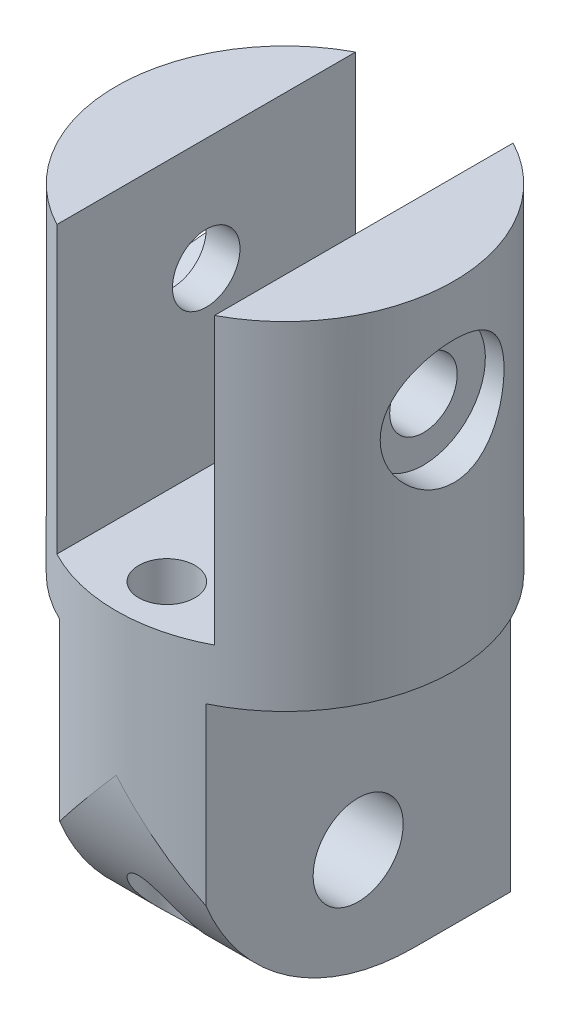
ISO-10303-21;
HEADER;
FILE_DESCRIPTION(('STEP AP214'),'2;1');
FILE_NAME('part.step','',(''),(''),'','','');
FILE_SCHEMA(('AUTOMOTIVE_DESIGN { 1 0 10303 214 1 1 1 1 }'));
ENDSEC;
DATA;
#1=APPLICATION_CONTEXT('core data for automotive mechanical design processes');
#2=APPLICATION_PROTOCOL_DEFINITION('international standard','automotive_design',2000,#1);
#3=PRODUCT_CONTEXT('',#1,'mechanical');
#4=PRODUCT('Part','Part','',(#3));
#5=PRODUCT_RELATED_PRODUCT_CATEGORY('part','',(#4));
#6=PRODUCT_DEFINITION_FORMATION('','',#4);
#7=PRODUCT_DEFINITION_CONTEXT('part definition',#1,'design');
#8=PRODUCT_DEFINITION('design','',#6,#7);
#9=PRODUCT_DEFINITION_SHAPE('','',#8);
#10=(LENGTH_UNIT() NAMED_UNIT(*) SI_UNIT(.MILLI.,.METRE.));
#11=(NAMED_UNIT(*) PLANE_ANGLE_UNIT() SI_UNIT($,.RADIAN.));
#12=(NAMED_UNIT(*) SI_UNIT($,.STERADIAN.) SOLID_ANGLE_UNIT());
#13=UNCERTAINTY_MEASURE_WITH_UNIT(LENGTH_MEASURE(1.E-05),#10,'distance_accuracy_value','');
#14=(GEOMETRIC_REPRESENTATION_CONTEXT(3) GLOBAL_UNCERTAINTY_ASSIGNED_CONTEXT((#13)) GLOBAL_UNIT_ASSIGNED_CONTEXT((#10,
#11,#12)) REPRESENTATION_CONTEXT('',''));
#15=CARTESIAN_POINT('',(0.,0.,0.));
#16=DIRECTION('',(0.,0.,1.));
#17=DIRECTION('',(1.,0.,0.));
#18=AXIS2_PLACEMENT_3D('',#15,#16,#17);
#19=CARTESIAN_POINT('',(3.25,7.,15.));
#20=DIRECTION('',(-1.,0.,0.));
#21=DIRECTION('',(0.,-1.,0.));
#22=AXIS2_PLACEMENT_3D('',#19,#20,#21);
#23=PLANE('',#22);
#24=CARTESIAN_POINT('',(3.25,-2.,7.5));
#25=DIRECTION('',(1.,0.,0.));
#26=DIRECTION('',(0.,1.,0.));
#27=AXIS2_PLACEMENT_3D('',#24,#25,#26);
#28=CIRCLE('',#27,2.);
#29=CARTESIAN_POINT('',(3.25,0.,7.5));
#30=VERTEX_POINT('',#29);
#31=EDGE_CURVE('E361',#30,#30,#28,.T.);
#32=ORIENTED_EDGE('',*,*,#31,.F.);
#33=EDGE_LOOP('',(#32));
#34=FACE_BOUND('',#33,.T.);
#35=DIRECTION('',(0.,1.,0.));
#36=VECTOR('',#35,1.);
#37=CARTESIAN_POINT('',(3.25,-7.,0.740747082702113));
#38=LINE('',#37,#36);
#39=CARTESIAN_POINT('',(3.25,-7.,0.740747082702113));
#40=VERTEX_POINT('',#39);
#41=CARTESIAN_POINT('',(3.25,7.,0.740747082702113));
#42=VERTEX_POINT('',#41);
#43=EDGE_CURVE('E240',#40,#42,#38,.T.);
#44=ORIENTED_EDGE('',*,*,#43,.T.);
#45=DIRECTION('',(0.,0.,-1.));
#46=VECTOR('',#45,1.);
#47=CARTESIAN_POINT('',(3.25,7.,15.));
#48=LINE('',#47,#46);
#49=CARTESIAN_POINT('',(3.25,7.,14.2592529172979));
#50=VERTEX_POINT('',#49);
#51=EDGE_CURVE('E379',#50,#42,#48,.T.);
#52=ORIENTED_EDGE('',*,*,#51,.F.);
#53=DIRECTION('',(0.,1.,0.));
#54=VECTOR('',#53,1.);
#55=CARTESIAN_POINT('',(3.25,-7.,14.2592529172979));
#56=LINE('',#55,#54);
#57=CARTESIAN_POINT('',(3.25,-0.777067038524808,14.2592529172979));
#58=VERTEX_POINT('',#57);
#59=EDGE_CURVE('E249',#58,#50,#56,.T.);
#60=ORIENTED_EDGE('',*,*,#59,.F.);
#61=CARTESIAN_POINT('',(3.25,3.,5.));
#62=DIRECTION('',(-1.,0.,0.));
#63=DIRECTION('',(0.,-1.,0.));
#64=AXIS2_PLACEMENT_3D('',#61,#62,#63);
#65=CIRCLE('',#64,10.);
#66=CARTESIAN_POINT('',(3.25,-7.,5.));
#67=VERTEX_POINT('',#66);
#68=EDGE_CURVE('E382',#58,#67,#65,.F.);
#69=ORIENTED_EDGE('',*,*,#68,.T.);
#70=DIRECTION('',(0.,0.,-1.));
#71=VECTOR('',#70,1.);
#72=CARTESIAN_POINT('',(3.25,-7.,15.));
#73=LINE('',#72,#71);
#74=EDGE_CURVE('E364',#67,#40,#73,.T.);
#75=ORIENTED_EDGE('',*,*,#74,.T.);
#76=EDGE_LOOP('',(#44,#52,#60,#69,#75));
#77=FACE_BOUND('',#76,.T.);
#78=ADVANCED_FACE('F68',(#34,#77),#23,.F.);
#79=CARTESIAN_POINT('',(-3.25,-7.,15.));
#80=DIRECTION('',(0.,1.,0.));
#81=DIRECTION('',(0.,0.,1.));
#82=AXIS2_PLACEMENT_3D('',#79,#80,#81);
#83=PLANE('',#82);
#84=CARTESIAN_POINT('',(0.,-7.,3.));
#85=DIRECTION('',(0.,-1.,0.));
#86=DIRECTION('',(0.,0.,-1.));
#87=AXIS2_PLACEMENT_3D('',#84,#85,#86);
#88=CIRCLE('',#87,1.25);
#89=CARTESIAN_POINT('',(0.,-7.,1.75));
#90=VERTEX_POINT('',#89);
#91=EDGE_CURVE('E649',#90,#90,#88,.T.);
#92=ORIENTED_EDGE('',*,*,#91,.F.);
#93=EDGE_LOOP('',(#92));
#94=FACE_BOUND('',#93,.T.);
#95=CARTESIAN_POINT('',(0.,-7.,7.5));
#96=DIRECTION('',(0.,1.,0.));
#97=DIRECTION('',(0.,0.,1.));
#98=AXIS2_PLACEMENT_3D('',#95,#96,#97);
#99=CIRCLE('',#98,7.5);
#100=CARTESIAN_POINT('',(-3.25,-7.,0.740747082702113));
#101=VERTEX_POINT('',#100);
#102=EDGE_CURVE('E250',#40,#101,#99,.T.);
#103=ORIENTED_EDGE('',*,*,#102,.F.);
#104=ORIENTED_EDGE('',*,*,#74,.F.);
#105=DIRECTION('',(1.,0.,0.));
#106=VECTOR('',#105,1.);
#107=CARTESIAN_POINT('',(-3.25,-7.,5.));
#108=LINE('',#107,#106);
#109=CARTESIAN_POINT('',(-3.25,-7.,5.));
#110=VERTEX_POINT('',#109);
#111=EDGE_CURVE('E384',#67,#110,#108,.F.);
#112=ORIENTED_EDGE('',*,*,#111,.T.);
#113=DIRECTION('',(0.,0.,-1.));
#114=VECTOR('',#113,1.);
#115=CARTESIAN_POINT('',(-3.25,-7.,15.));
#116=LINE('',#115,#114);
#117=EDGE_CURVE('E373',#110,#101,#116,.T.);
#118=ORIENTED_EDGE('',*,*,#117,.T.);
#119=EDGE_LOOP('',(#103,#104,#112,#118));
#120=FACE_BOUND('',#119,.T.);
#121=ADVANCED_FACE('F329',(#94,#120),#83,.F.);
#122=CARTESIAN_POINT('',(-3.25,7.,15.));
#123=DIRECTION('',(1.,0.,0.));
#124=DIRECTION('',(0.,1.,0.));
#125=AXIS2_PLACEMENT_3D('',#122,#123,#124);
#126=PLANE('',#125);
#127=CARTESIAN_POINT('',(-3.25,-2.,7.5));
#128=DIRECTION('',(1.,0.,0.));
#129=DIRECTION('',(0.,1.,0.));
#130=AXIS2_PLACEMENT_3D('',#127,#128,#129);
#131=CIRCLE('',#130,2.);
#132=CARTESIAN_POINT('',(-3.25,0.,7.5));
#133=VERTEX_POINT('',#132);
#134=EDGE_CURVE('E359',#133,#133,#131,.T.);
#135=ORIENTED_EDGE('',*,*,#134,.T.);
#136=EDGE_LOOP('',(#135));
#137=FACE_BOUND('',#136,.T.);
#138=CARTESIAN_POINT('',(-3.25,3.,5.));
#139=DIRECTION('',(1.,0.,0.));
#140=DIRECTION('',(0.,1.,0.));
#141=AXIS2_PLACEMENT_3D('',#138,#139,#140);
#142=CIRCLE('',#141,10.);
#143=CARTESIAN_POINT('',(-3.25,-0.777067038524727,14.2592529172979));
#144=VERTEX_POINT('',#143);
#145=EDGE_CURVE('E386',#110,#144,#142,.F.);
#146=ORIENTED_EDGE('',*,*,#145,.T.);
#147=DIRECTION('',(0.,1.,0.));
#148=VECTOR('',#147,1.);
#149=CARTESIAN_POINT('',(-3.25,-7.,14.2592529172979));
#150=LINE('',#149,#148);
#151=CARTESIAN_POINT('',(-3.25,7.,14.2592529172979));
#152=VERTEX_POINT('',#151);
#153=EDGE_CURVE('E238',#144,#152,#150,.T.);
#154=ORIENTED_EDGE('',*,*,#153,.T.);
#155=DIRECTION('',(0.,0.,-1.));
#156=VECTOR('',#155,1.);
#157=CARTESIAN_POINT('',(-3.25,7.,15.));
#158=LINE('',#157,#156);
#159=CARTESIAN_POINT('',(-3.25,7.,0.740747082702112));
#160=VERTEX_POINT('',#159);
#161=EDGE_CURVE('E376',#152,#160,#158,.T.);
#162=ORIENTED_EDGE('',*,*,#161,.T.);
#163=DIRECTION('',(0.,1.,0.));
#164=VECTOR('',#163,1.);
#165=CARTESIAN_POINT('',(-3.25,-7.,0.740747082702113));
#166=LINE('',#165,#164);
#167=EDGE_CURVE('E412',#101,#160,#166,.T.);
#168=ORIENTED_EDGE('',*,*,#167,.F.);
#169=ORIENTED_EDGE('',*,*,#117,.F.);
#170=EDGE_LOOP('',(#146,#154,#162,#168,#169));
#171=FACE_BOUND('',#170,.T.);
#172=ADVANCED_FACE('F334',(#137,#171),#126,.F.);
#173=CARTESIAN_POINT('',(0.,3.,5.));
#174=DIRECTION('',(-1.,0.,0.));
#175=DIRECTION('',(0.,0.,1.));
#176=AXIS2_PLACEMENT_3D('',#173,#174,#175);
#177=CYLINDRICAL_SURFACE('',#176,10.);
#178=CARTESIAN_POINT('',(0.,-4.60034588039679,11.4988262400479));
#179=CARTESIAN_POINT('',(0.0575288109608131,-4.60034633192946,11.4988256093035));
#180=CARTESIAN_POINT('',(0.11505399772144,-4.59693401826059,11.502822715136));
#181=CARTESIAN_POINT('',(0.22823665096081,-4.5834761227697,11.5185116248287));
#182=CARTESIAN_POINT('',(0.283893883210376,-4.57342971231711,11.5302043899131));
#183=CARTESIAN_POINT('',(0.391522903078539,-4.54727481070758,11.560414189299));
#184=CARTESIAN_POINT('',(0.443509328590721,-4.53119222670741,11.578902052222));
#185=CARTESIAN_POINT('',(0.542970946334787,-4.49367037095389,11.6216094500825));
#186=CARTESIAN_POINT('',(0.590444207603541,-4.47222882047104,11.6458314230352));
#187=CARTESIAN_POINT('',(0.693858382566063,-4.41754856445222,11.7068701017729));
#188=CARTESIAN_POINT('',(0.74800982895763,-4.38270365386441,11.7452795553846));
#189=CARTESIAN_POINT('',(0.847148183723735,-4.30681705487514,11.8274129335695));
#190=CARTESIAN_POINT('',(0.89211987702798,-4.26576527170702,11.8711454925512));
#191=CARTESIAN_POINT('',(0.987252420045894,-4.16367094789748,11.9777470851912));
#192=CARTESIAN_POINT('',(1.03375682534324,-4.10064843319519,12.0419724818224));
#193=CARTESIAN_POINT('',(1.11202550102491,-3.96841120618138,12.1728634669199));
#194=CARTESIAN_POINT('',(1.14376846925352,-3.89918771589937,12.2395324330415));
#195=CARTESIAN_POINT('',(1.20512691121574,-3.72575254744175,12.4015979723462));
#196=CARTESIAN_POINT('',(1.22801220853734,-3.61925054145639,12.4970726247963));
#197=CARTESIAN_POINT('',(1.25192625827192,-3.40072630611675,12.6845018482235));
#198=CARTESIAN_POINT('',(1.25290080853041,-3.28869107409675,12.7764471281507));
#199=CARTESIAN_POINT('',(1.2390160739484,-3.10025953801128,12.9243894094759));
#200=CARTESIAN_POINT('',(1.22941770428853,-3.02467078036612,12.9819973062648));
#201=CARTESIAN_POINT('',(1.20265869273446,-2.87271614168859,13.0944508219831));
#202=CARTESIAN_POINT('',(1.18549447992938,-2.79634991035228,13.1492951229198));
#203=CARTESIAN_POINT('',(1.14397630217485,-2.64352762751517,13.2558626611615));
#204=CARTESIAN_POINT('',(1.1196297934206,-2.56707175066068,13.3075890685247));
#205=CARTESIAN_POINT('',(1.0637867813495,-2.4146576671145,13.4077218470943));
#206=CARTESIAN_POINT('',(1.03229458006037,-2.33869918916016,13.4561301931831));
#207=CARTESIAN_POINT('',(0.959546911817907,-2.18327021358453,13.5523439188718));
#208=CARTESIAN_POINT('',(0.917797461428203,-2.10388405447856,13.5999146411363));
#209=CARTESIAN_POINT('',(0.824662482152894,-1.94813724713139,13.6904545809013));
#210=CARTESIAN_POINT('',(0.773285416874435,-1.87177401232619,13.7334277883316));
#211=CARTESIAN_POINT('',(0.676695759717014,-1.74841146843393,13.8009016608124));
#212=CARTESIAN_POINT('',(0.634678644034613,-1.69976793648386,13.8269441706631));
#213=CARTESIAN_POINT('',(0.543764619578198,-1.60733393640184,13.8755374312719));
#214=CARTESIAN_POINT('',(0.494882481116181,-1.56353340082824,13.8980954657454));
#215=CARTESIAN_POINT('',(0.410328609425263,-1.50057299344001,13.9300362657961));
#216=CARTESIAN_POINT('',(0.377364323238513,-1.47863442485303,13.9410472218018));
#217=CARTESIAN_POINT('',(0.308269866690451,-1.43908401630296,13.9607487164632));
#218=CARTESIAN_POINT('',(0.272144496533989,-1.42146576535685,13.9694426950006));
#219=CARTESIAN_POINT('',(0.204140015054733,-1.39500732552652,13.9824321515032));
#220=CARTESIAN_POINT('',(0.172770922493601,-1.38513258262856,13.9872509335304));
#221=CARTESIAN_POINT('',(0.10863906512088,-1.3702186469195,13.9945127413908));
#222=CARTESIAN_POINT('',(0.0758780804831299,-1.36517346082817,13.9969587118357));
#223=CARTESIAN_POINT('',(0.00971565662024547,-1.36049332526411,13.999228082882));
#224=CARTESIAN_POINT('',(-0.0236880276005255,-1.36088324321488,13.9990394291871));
#225=CARTESIAN_POINT('',(-0.0898697850396133,-1.36708221585887,13.9960326446625));
#226=CARTESIAN_POINT('',(-0.12264736944618,-1.37289534121178,13.9932125386644));
#227=CARTESIAN_POINT('',(-0.192498993484608,-1.39076317365085,13.9845039818664));
#228=CARTESIAN_POINT('',(-0.229268404492208,-1.40376175841571,13.9781502759771));
#229=CARTESIAN_POINT('',(-0.299995279155415,-1.43484740134685,13.9628359879126));
#230=CARTESIAN_POINT('',(-0.333946810007977,-1.45294485968761,13.9538700763329));
#231=CARTESIAN_POINT('',(-0.418925600500643,-1.50503533887645,13.9278178923304));
#232=CARTESIAN_POINT('',(-0.467632638347218,-1.54196424707584,13.909126433341));
#233=CARTESIAN_POINT('',(-0.558564300251688,-1.62136560507975,13.8682014347293));
#234=CARTESIAN_POINT('',(-0.600770050090257,-1.66385355695524,13.8459579501095));
#235=CARTESIAN_POINT('',(-0.678801636651221,-1.75107385940053,13.799413769684));
#236=CARTESIAN_POINT('',(-0.714760353406768,-1.79572378952148,13.7751782289425));
#237=CARTESIAN_POINT('',(-0.782368998157438,-1.88709197799037,13.724624021988));
#238=CARTESIAN_POINT('',(-0.814015009233281,-1.93381206615915,13.6983034959845));
#239=CARTESIAN_POINT('',(-0.873578262146656,-2.02867607236967,13.6438079702081));
#240=CARTESIAN_POINT('',(-0.901487844310031,-2.07682267540891,13.6156293325072));
#241=CARTESIAN_POINT('',(-0.953869165706419,-2.17399414365024,13.5576276254842));
#242=CARTESIAN_POINT('',(-0.978339944562463,-2.22301924990456,13.5278041000089));
#243=CARTESIAN_POINT('',(-1.03648457622005,-2.34837571239289,13.4500224067966));
#244=CARTESIAN_POINT('',(-1.06794492165718,-2.42508593896396,13.4010069487532));
#245=CARTESIAN_POINT('',(-1.12359720816828,-2.57896430130894,13.2996181391025));
#246=CARTESIAN_POINT('',(-1.14778503835172,-2.65613267101885,13.2472429085551));
#247=CARTESIAN_POINT('',(-1.18880186967856,-2.81020378415608,13.1394324196061));
#248=CARTESIAN_POINT('',(-1.2056368062501,-2.8871066919307,13.0839996701717));
#249=CARTESIAN_POINT('',(-1.23159320381571,-3.04008538662955,12.970348311449));
#250=CARTESIAN_POINT('',(-1.2407185329799,-3.11616156941276,12.912131114723));
#251=CARTESIAN_POINT('',(-1.25286792344638,-3.30085753472534,12.766499936122));
#252=CARTESIAN_POINT('',(-1.2513126972625,-3.40875200184953,12.6777134732531));
#253=CARTESIAN_POINT('',(-1.22772366104796,-3.61938148403095,12.4968619169247));
#254=CARTESIAN_POINT('',(-1.20573097558767,-3.72212642360836,12.4048037644697));
#255=CARTESIAN_POINT('',(-1.14743386723128,-3.8900628974733,12.2481774324844));
#256=CARTESIAN_POINT('',(-1.11731814138053,-3.95734634387134,12.1835632594184));
#257=CARTESIAN_POINT('',(-1.04332667285176,-4.0862124112587,12.0564668539613));
#258=CARTESIAN_POINT('',(-0.999468461074937,-4.14780216661484,11.9939820172111));
#259=CARTESIAN_POINT('',(-0.908823343821531,-4.24931724766382,11.8885005866831));
#260=CARTESIAN_POINT('',(-0.865205843162854,-4.2909138401453,11.8444000545688));
#261=CARTESIAN_POINT('',(-0.76883757221327,-4.36814251288804,11.7611894906291));
#262=CARTESIAN_POINT('',(-0.716098431613276,-4.40378207569116,11.7220732130628));
#263=CARTESIAN_POINT('',(-0.612245124736067,-4.46172352984542,11.657643266576));
#264=CARTESIAN_POINT('',(-0.562586109481275,-4.48527243298603,11.6311133106998));
#265=CARTESIAN_POINT('',(-0.458065299417217,-4.52641813587298,11.584375566612));
#266=CARTESIAN_POINT('',(-0.403206475147318,-4.54401830807232,11.5641641967587));
#267=CARTESIAN_POINT('',(-0.291201637526191,-4.57200141151039,11.5318637455773));
#268=CARTESIAN_POINT('',(-0.234168560095787,-4.58257937423715,11.5195555175503));
#269=CARTESIAN_POINT('',(-0.118088610350123,-4.59675024599106,11.5030383998551));
#270=CARTESIAN_POINT('',(-0.0590423964677331,-4.60034541698428,11.4988268873873));
#271=CARTESIAN_POINT('',(0.,-4.60034588039679,11.4988262400479));
#272=B_SPLINE_CURVE_WITH_KNOTS('',3,(#178,#179,#180,#181,#182,#183,#184,#185,#186,#187,#188,
#189,#190,#191,#192,#193,#194,#195,#196,#197,#198,#199,#200,#201,#202,#203,#204,#205,#206,#207,
#208,#209,#210,#211,#212,#213,#214,#215,#216,#217,#218,#219,#220,#221,#222,#223,#224,#225,#226,
#227,#228,#229,#230,#231,#232,#233,#234,#235,#236,#237,#238,#239,#240,#241,#242,#243,#244,#245,
#246,#247,#248,#249,#250,#251,#252,#253,#254,#255,#256,#257,#258,#259,#260,#261,#262,#263,#264,
#265,#266,#267,#268,#269,#270,#271),.UNSPECIFIED.,.T.,.F.,(4,2,2,2,2,2,2,2,2,2,2,2,2,2,2,2,2,2,
2,2,2,2,2,2,2,2,2,2,2,2,2,2,2,2,2,2,2,2,2,2,2,2,2,2,2,2,4),(0.,0.172348273756097,
0.344718078712481,0.516356381687259,0.688067792913604,0.911779782670741,1.13585960792365,
1.43805653794473,1.74068822377861,2.17289589147549,2.60617262432262,2.89241887086686,
3.17880036422053,3.46488559482381,3.75079904413221,4.05491767460736,4.35877019896172,
4.56645367834022,4.77369697735467,4.89669523302743,5.0195098500147,5.11882624455042,
5.21801923115933,5.31766620732977,5.41738803875374,5.53527045520422,5.65339507916606,
5.84407282185146,6.03529410095019,6.22174555510802,6.40836523689131,6.59536181455266,
6.78241051261683,7.07097917352888,7.35971064655029,7.64820861604563,7.93656175026965,
8.35438832069885,8.77137595038052,9.06454630970578,9.35734419210841,9.58060303576063,
9.80357930464446,9.98592361306855,10.1681643728299,10.3451044636672,10.5219872279666),.UNSPECIFIED.);
#273=CARTESIAN_POINT('',(0.,-4.60034588039679,11.4988262400479));
#274=VERTEX_POINT('',#273);
#275=EDGE_CURVE('E205',#274,#274,#272,.T.);
#276=ORIENTED_EDGE('',*,*,#275,.F.);
#277=EDGE_LOOP('',(#276));
#278=FACE_BOUND('',#277,.T.);
#279=CARTESIAN_POINT('',(-3.25,-0.777067038524808,14.2592529172979));
#280=CARTESIAN_POINT('',(-3.11964803441231,-0.623422022657622,14.3219224333858));
#281=CARTESIAN_POINT('',(-2.98826751006328,-0.469006401054278,14.3804577255213));
#282=CARTESIAN_POINT('',(-2.7237404145902,-0.158847919875885,14.4894004376096));
#283=CARTESIAN_POINT('',(-2.59059398915032,-0.00310517016124126,14.539808523586));
#284=CARTESIAN_POINT('',(-2.1888915842863,0.46585242207751,14.6790735815163));
#285=CARTESIAN_POINT('',(-1.91809052694975,0.78077536711749,14.7559627524007));
#286=CARTESIAN_POINT('',(-1.37572389886744,1.4099863558356,14.8779292423823));
#287=CARTESIAN_POINT('',(-1.10419730090432,1.72424533420997,14.9233371711216));
#288=CARTESIAN_POINT('',(-0.5594483269617,2.35399928323636,14.984120133363));
#289=CARTESIAN_POINT('',(-0.286226977240884,2.66949346995055,14.9995118431247));
#290=CARTESIAN_POINT('',(-0.00872869143398145,2.9899209752028,14.9999961890182));
#291=CARTESIAN_POINT('',(-0.00436433249316354,2.9949605028181,14.9999999984407));
#292=CARTESIAN_POINT('',(0.,3.,15.));
#293=B_SPLINE_CURVE_WITH_KNOTS('',3,(#279,#280,#281,#282,#283,#284,#285,#286,#287,#288,#289,
#290,#291,#292),.UNSPECIFIED.,.F.,.F.,(4,2,2,2,2,2,4),(0.,0.632933239584302,1.26581458397719,
2.53166454368447,3.78401078214235,5.03566104994836,5.05566105321367),.UNSPECIFIED.);
#294=CARTESIAN_POINT('',(0.,3.,15.));
#295=VERTEX_POINT('',#294);
#296=EDGE_CURVE('E242',#144,#295,#293,.T.);
#297=ORIENTED_EDGE('',*,*,#296,.F.);
#298=ORIENTED_EDGE('',*,*,#145,.F.);
#299=ORIENTED_EDGE('',*,*,#111,.F.);
#300=ORIENTED_EDGE('',*,*,#68,.F.);
#301=CARTESIAN_POINT('',(3.25,-0.777067038524808,14.2592529172979));
#302=CARTESIAN_POINT('',(3.11964803441231,-0.623422022657624,14.3219224333858));
#303=CARTESIAN_POINT('',(2.98826751006328,-0.46900640105428,14.3804577255213));
#304=CARTESIAN_POINT('',(2.7237404145902,-0.158847919875886,14.4894004376096));
#305=CARTESIAN_POINT('',(2.59059398915033,-0.00310517016124023,14.539808523586));
#306=CARTESIAN_POINT('',(2.1888915842863,0.465852422077514,14.6790735815163));
#307=CARTESIAN_POINT('',(1.91809052694976,0.780775367117497,14.7559627524007));
#308=CARTESIAN_POINT('',(1.37572389886743,1.40998635583559,14.8779292423823));
#309=CARTESIAN_POINT('',(1.10419730090428,1.72424533420994,14.9233371711216));
#310=CARTESIAN_POINT('',(0.55944832696173,2.35399928323638,14.984120133363));
#311=CARTESIAN_POINT('',(0.286226977241005,2.66949346995065,14.9995118431247));
#312=CARTESIAN_POINT('',(0.00872869143398562,2.9899209752028,14.9999961890182));
#313=CARTESIAN_POINT('',(0.00436433249316565,2.99496050281811,14.9999999984407));
#314=CARTESIAN_POINT('',(0.,3.,15.));
#315=B_SPLINE_CURVE_WITH_KNOTS('',3,(#301,#302,#303,#304,#305,#306,#307,#308,#309,#310,#311,
#312,#313,#314),.UNSPECIFIED.,.F.,.F.,(4,2,2,2,2,2,4),(0.,0.632933239584303,1.26581458397719,
2.53166454368448,3.78401078214235,5.03566104994836,5.05566105321368),.UNSPECIFIED.);
#316=EDGE_CURVE('E262',#58,#295,#315,.T.);
#317=ORIENTED_EDGE('',*,*,#316,.T.);
#318=EDGE_LOOP('',(#297,#298,#299,#300,#317));
#319=FACE_BOUND('',#318,.T.);
#320=ADVANCED_FACE('F70',(#278,#319),#177,.T.);
#321=CARTESIAN_POINT('',(0.,22.,7.5));
#322=DIRECTION('',(0.,1.,0.));
#323=DIRECTION('',(0.,0.,1.));
#324=AXIS2_PLACEMENT_3D('',#321,#322,#323);
#325=PLANE('',#324);
#326=DIRECTION('',(0.,0.,1.));
#327=VECTOR('',#326,1.);
#328=CARTESIAN_POINT('',(-3.5,22.,7.5));
#329=LINE('',#328,#327);
#330=CARTESIAN_POINT('',(-3.5,22.,0.8667504192892));
#331=VERTEX_POINT('',#330);
#332=CARTESIAN_POINT('',(-3.5,22.,14.1332495807108));
#333=VERTEX_POINT('',#332);
#334=EDGE_CURVE('E390',#331,#333,#329,.T.);
#335=ORIENTED_EDGE('',*,*,#334,.F.);
#336=CARTESIAN_POINT('',(0.,22.,7.5));
#337=DIRECTION('',(0.,1.,0.));
#338=DIRECTION('',(0.,0.,1.));
#339=AXIS2_PLACEMENT_3D('',#336,#337,#338);
#340=CIRCLE('',#339,7.5);
#341=EDGE_CURVE('E367',#331,#333,#340,.T.);
#342=ORIENTED_EDGE('',*,*,#341,.T.);
#343=EDGE_LOOP('',(#335,#342));
#344=FACE_BOUND('',#343,.T.);
#345=ADVANCED_FACE('F345',(#344),#325,.T.);
#346=CARTESIAN_POINT('',(-3.25,-2.,7.5));
#347=DIRECTION('',(1.,0.,0.));
#348=DIRECTION('',(0.,1.,0.));
#349=AXIS2_PLACEMENT_3D('',#346,#347,#348);
#350=CYLINDRICAL_SURFACE('',#349,2.);
#351=ORIENTED_EDGE('',*,*,#134,.F.);
#352=EDGE_LOOP('',(#351));
#353=FACE_BOUND('',#352,.T.);
#354=ORIENTED_EDGE('',*,*,#31,.T.);
#355=EDGE_LOOP('',(#354));
#356=FACE_BOUND('',#355,.T.);
#357=ADVANCED_FACE('F342',(#353,#356),#350,.F.);
#358=CARTESIAN_POINT('',(0.,7.,7.5));
#359=DIRECTION('',(0.,1.,0.));
#360=DIRECTION('',(0.,0.,1.));
#361=AXIS2_PLACEMENT_3D('',#358,#359,#360);
#362=PLANE('',#361);
#363=CARTESIAN_POINT('',(0.,7.,7.5));
#364=DIRECTION('',(0.,1.,0.));
#365=DIRECTION('',(0.,0.,1.));
#366=AXIS2_PLACEMENT_3D('',#363,#364,#365);
#367=CIRCLE('',#366,7.5);
#368=EDGE_CURVE('E422',#50,#42,#367,.T.);
#369=ORIENTED_EDGE('',*,*,#368,.F.);
#370=ORIENTED_EDGE('',*,*,#51,.T.);
#371=EDGE_LOOP('',(#369,#370));
#372=FACE_BOUND('',#371,.T.);
#373=ADVANCED_FACE('F344',(#372),#362,.F.);
#374=CARTESIAN_POINT('',(0.,22.,7.5));
#375=DIRECTION('',(0.,-1.,0.));
#376=DIRECTION('',(0.,0.,-1.));
#377=AXIS2_PLACEMENT_3D('',#374,#375,#376);
#378=CYLINDRICAL_SURFACE('',#377,7.5);
#379=DIRECTION('',(0.,-1.,0.));
#380=VECTOR('',#379,1.);
#381=CARTESIAN_POINT('',(-6.75925291729789,22.,4.25));
#382=LINE('',#381,#380);
#383=CARTESIAN_POINT('',(-6.75925291729789,15.1236116251337,4.25));
#384=VERTEX_POINT('',#383);
#385=CARTESIAN_POINT('',(-6.75925291729789,18.8763883748663,4.25));
#386=VERTEX_POINT('',#385);
#387=EDGE_CURVE('E78',#384,#386,#382,.F.);
#388=ORIENTED_EDGE('',*,*,#387,.T.);
#389=CARTESIAN_POINT('',(0.,20.7527767497326,7.5));
#390=DIRECTION('',(0.,0.866025403784439,-0.5));
#391=DIRECTION('',(0.,-0.5,-0.866025403784439));
#392=AXIS2_PLACEMENT_3D('',#389,#390,#391);
#393=ELLIPSE('',#392,8.66025403784438,7.5);
#394=CARTESIAN_POINT('',(-7.50000000000001,20.7527767497326,7.5));
#395=VERTEX_POINT('',#394);
#396=EDGE_CURVE('E12',#386,#395,#393,.T.);
#397=ORIENTED_EDGE('',*,*,#396,.T.);
#398=CARTESIAN_POINT('',(0.,20.7527767497326,7.5));
#399=DIRECTION('',(0.,0.866025403784439,0.5));
#400=DIRECTION('',(0.,-0.5,0.866025403784439));
#401=AXIS2_PLACEMENT_3D('',#398,#399,#400);
#402=ELLIPSE('',#401,8.66025403784439,7.5);
#403=CARTESIAN_POINT('',(-6.75925291729789,18.8763883748663,10.75));
#404=VERTEX_POINT('',#403);
#405=EDGE_CURVE('E185',#395,#404,#402,.T.);
#406=ORIENTED_EDGE('',*,*,#405,.T.);
#407=DIRECTION('',(0.,-1.,0.));
#408=VECTOR('',#407,1.);
#409=CARTESIAN_POINT('',(-6.75925291729789,22.,10.75));
#410=LINE('',#409,#408);
#411=CARTESIAN_POINT('',(-6.75925291729789,15.1236116251337,10.75));
#412=VERTEX_POINT('',#411);
#413=EDGE_CURVE('E658',#404,#412,#410,.T.);
#414=ORIENTED_EDGE('',*,*,#413,.T.);
#415=CARTESIAN_POINT('',(0.,13.2472232502674,7.5));
#416=DIRECTION('',(0.,-0.866025403784439,0.5));
#417=DIRECTION('',(0.,-0.5,-0.866025403784439));
#418=AXIS2_PLACEMENT_3D('',#415,#416,#417);
#419=ELLIPSE('',#418,8.66025403784439,7.5);
#420=CARTESIAN_POINT('',(-7.5,13.2472232502674,7.5));
#421=VERTEX_POINT('',#420);
#422=EDGE_CURVE('E644',#412,#421,#419,.T.);
#423=ORIENTED_EDGE('',*,*,#422,.T.);
#424=CARTESIAN_POINT('',(0.,13.2472232502674,7.5));
#425=DIRECTION('',(0.,-0.866025403784439,-0.5));
#426=DIRECTION('',(0.,-0.5,0.866025403784439));
#427=AXIS2_PLACEMENT_3D('',#424,#425,#426);
#428=ELLIPSE('',#427,8.66025403784439,7.5);
#429=EDGE_CURVE('E641',#421,#384,#428,.T.);
#430=ORIENTED_EDGE('',*,*,#429,.T.);
#431=EDGE_LOOP('',(#388,#397,#406,#414,#423,#430));
#432=FACE_BOUND('',#431,.T.);
#433=CARTESIAN_POINT('',(7.5,14.25,7.5));
#434=CARTESIAN_POINT('',(7.50000312186943,14.2499957601559,7.64916340091462));
#435=CARTESIAN_POINT('',(7.49551083407196,14.2621745142851,7.79829715261848));
#436=CARTESIAN_POINT('',(7.47803771691331,14.3103807639427,8.09212061063863));
#437=CARTESIAN_POINT('',(7.46505769251259,14.3464059979212,8.23681073701747));
#438=CARTESIAN_POINT('',(7.43200599882739,14.4408685459559,8.51746784637522));
#439=CARTESIAN_POINT('',(7.41194764249896,14.4992638038986,8.65345064275874));
#440=CARTESIAN_POINT('',(7.36674725461798,14.6365998026205,8.91368339201444));
#441=CARTESIAN_POINT('',(7.34160392586796,14.7155457874537,9.03793033913379));
#442=CARTESIAN_POINT('',(7.28769120419502,14.8951165871431,9.2762429222357));
#443=CARTESIAN_POINT('',(7.25882233991119,14.9964330069993,9.38976472910907));
#444=CARTESIAN_POINT('',(7.20121334184221,15.2164002540435,9.59863947514447));
#445=CARTESIAN_POINT('',(7.17247324728629,15.335056036644,9.69398720232952));
#446=CARTESIAN_POINT('',(7.11723192199314,15.5915596285549,9.86719005872891));
#447=CARTESIAN_POINT('',(7.09084889561059,15.7299454567554,9.94428985961203));
#448=CARTESIAN_POINT('',(7.04484932142569,16.0188406266334,10.0738807153727));
#449=CARTESIAN_POINT('',(7.02523020673632,16.1693453424172,10.126381108384));
#450=CARTESIAN_POINT('',(6.99603990329749,16.4719588814006,10.2031578776842));
#451=CARTESIAN_POINT('',(6.98610194555094,16.6237687440343,10.2284685676662));
#452=CARTESIAN_POINT('',(6.97632326042149,16.929781189296,10.2533816996786));
#453=CARTESIAN_POINT('',(6.97647859485257,17.0839828152304,10.2529941686023));
#454=CARTESIAN_POINT('',(6.98655161563675,17.3810789225906,10.2273152463416));
#455=CARTESIAN_POINT('',(6.99591416236741,17.5241180714193,10.2034399938661));
#456=CARTESIAN_POINT('',(7.02242705549906,17.8039973045031,10.1337980138));
#457=CARTESIAN_POINT('',(7.03957852258203,17.9408364935813,10.088028135926));
#458=CARTESIAN_POINT('',(7.08008337610026,18.2073857915592,9.97508832183277));
#459=CARTESIAN_POINT('',(7.10354498086313,18.3369185940038,9.90754043957437));
#460=CARTESIAN_POINT('',(7.15398860670264,18.5832293506763,9.75322516181072));
#461=CARTESIAN_POINT('',(7.18097180350953,18.7000030210703,9.66645134069005));
#462=CARTESIAN_POINT('',(7.23752687525343,18.9253454837079,9.46960155284458));
#463=CARTESIAN_POINT('',(7.26715387777086,19.032910199767,9.35838932735392));
#464=CARTESIAN_POINT('',(7.32416772152515,19.2281537541427,9.11915779399269));
#465=CARTESIAN_POINT('',(7.3515542477326,19.3158297990106,8.99113612914646));
#466=CARTESIAN_POINT('',(7.40150404263882,19.469849921192,8.71944943250202));
#467=CARTESIAN_POINT('',(7.42399328235867,19.5358733353786,8.57558804380358));
#468=CARTESIAN_POINT('',(7.46106828194135,19.6424524315738,8.27777168193606));
#469=CARTESIAN_POINT('',(7.47565739110895,19.6830189073552,8.12382101725383));
#470=CARTESIAN_POINT('',(7.49470661210037,19.7356341007007,7.81865715690413));
#471=CARTESIAN_POINT('',(7.49964681722227,19.7490358318725,7.66770697278252));
#472=CARTESIAN_POINT('',(7.50031608885126,19.7508630018728,7.36565203255629));
#473=CARTESIAN_POINT('',(7.49604709187873,19.7392936916369,7.21454731562548));
#474=CARTESIAN_POINT('',(7.47909471176213,19.6925452079771,6.92222898460096));
#475=CARTESIAN_POINT('',(7.46672323625137,19.6582406720003,6.7808555379685));
#476=CARTESIAN_POINT('',(7.43512235809386,19.5681349472647,6.50596090832168));
#477=CARTESIAN_POINT('',(7.41589206317618,19.5123309615443,6.37244074958353));
#478=CARTESIAN_POINT('',(7.3717934654489,19.3790539116285,6.11272893005816));
#479=CARTESIAN_POINT('',(7.34677844528394,19.301001869951,5.98686004951381));
#480=CARTESIAN_POINT('',(7.29389308718916,19.1261036082178,5.74959324541106));
#481=CARTESIAN_POINT('',(7.26602173076095,19.0292506731475,5.63820051602461));
#482=CARTESIAN_POINT('',(7.20858443222809,18.813177374235,5.42659777286201));
#483=CARTESIAN_POINT('',(7.17901017230758,18.6930149402375,5.32734951094925));
#484=CARTESIAN_POINT('',(7.12301420495134,18.4371450050785,5.15025082554627));
#485=CARTESIAN_POINT('',(7.09659271654603,18.3014364251721,5.0724018882281));
#486=CARTESIAN_POINT('',(7.05004267507774,18.0174626284658,4.94034362890839));
#487=CARTESIAN_POINT('',(7.02993081583834,17.8691653988561,4.88619687043256));
#488=CARTESIAN_POINT('',(6.99881623412452,17.564621151899,4.80397675168701));
#489=CARTESIAN_POINT('',(6.98780821140261,17.4083788165147,4.77588821917411));
#490=CARTESIAN_POINT('',(6.97683139543633,17.1027486399612,4.74790483037546));
#491=CARTESIAN_POINT('',(6.97622414135252,16.9535317080346,4.74637927832575));
#492=CARTESIAN_POINT('',(6.98449276936025,16.6570884497829,4.76742136880885));
#493=CARTESIAN_POINT('',(6.99336783146823,16.5098619524497,4.789986928062));
#494=CARTESIAN_POINT('',(7.01908063198066,16.225730914034,4.85732302895733));
#495=CARTESIAN_POINT('',(7.03568945153917,16.0886530299248,4.90145689764079));
#496=CARTESIAN_POINT('',(7.0748745278557,15.8237608470382,5.01012643456598));
#497=CARTESIAN_POINT('',(7.09745226019147,15.695948848854,5.07466714836784));
#498=CARTESIAN_POINT('',(7.14745651289183,15.446173516875,5.2261214625784));
#499=CARTESIAN_POINT('',(7.17507087475862,15.3248355716804,5.31400373788159));
#500=CARTESIAN_POINT('',(7.23136315938062,15.0981067555171,5.50811900047636));
#501=CARTESIAN_POINT('',(7.26004141030265,14.9927208569003,5.61435768756782));
#502=CARTESIAN_POINT('',(7.31698041886032,14.7954400202964,5.84862840053256));
#503=CARTESIAN_POINT('',(7.34514593066589,14.7045025963147,5.97749345971985));
#504=CARTESIAN_POINT('',(7.39633669940812,14.5456226545033,6.24965784854994));
#505=CARTESIAN_POINT('',(7.41936193536523,14.4776802305249,6.39295723710164));
#506=CARTESIAN_POINT('',(7.45811714803401,14.3658300233738,6.69376598407588));
#507=CARTESIAN_POINT('',(7.4736521370045,14.3225597743705,6.85153953395494));
#508=CARTESIAN_POINT('',(7.49458959004745,14.2646534781244,7.17288901781912));
#509=CARTESIAN_POINT('',(7.4999965772887,14.2500046484207,7.336462328356));
#510=CARTESIAN_POINT('',(7.5,14.25,7.5));
#511=B_SPLINE_CURVE_WITH_KNOTS('',3,(#433,#434,#435,#436,#437,#438,#439,#440,#441,#442,#443,
#444,#445,#446,#447,#448,#449,#450,#451,#452,#453,#454,#455,#456,#457,#458,#459,#460,#461,#462,
#463,#464,#465,#466,#467,#468,#469,#470,#471,#472,#473,#474,#475,#476,#477,#478,#479,#480,#481,
#482,#483,#484,#485,#486,#487,#488,#489,#490,#491,#492,#493,#494,#495,#496,#497,#498,#499,#500,
#501,#502,#503,#504,#505,#506,#507,#508,#509,#510),.UNSPECIFIED.,.T.,.F.,(4,2,2,2,2,2,2,2,2,2,2,
2,2,2,2,2,2,2,2,2,2,2,2,2,2,2,2,2,2,2,2,2,2,2,2,2,2,2,4),(0.,0.446887269349348,0.89373216292337,
1.33974106914938,1.7858638979375,2.24842473965862,2.71111803601497,3.1905067289315,
3.66971329430219,4.12996375453753,4.5900346359978,5.0239670519462,5.45796192255757,
5.89993527296308,6.34205656133036,6.81248619551747,7.28298186270095,7.76015995462979,
8.23713558552159,8.68970480563612,9.14217886831116,9.57818454876607,10.0142469703521,
10.462896209775,10.9117059866708,11.385386450699,11.8590998032843,12.3340561236824,
12.80873572978,13.254164536792,13.6995548284528,14.13252653843,14.5656053837986,15.020648736522,
15.4758336382825,15.9541458857871,16.4324600854427,16.9226310274791,17.4125830067758),.UNSPECIFIED.);
#512=CARTESIAN_POINT('',(7.5,14.25,7.5));
#513=VERTEX_POINT('',#512);
#514=EDGE_CURVE('E274',#513,#513,#511,.T.);
#515=ORIENTED_EDGE('',*,*,#514,.T.);
#516=EDGE_LOOP('',(#515));
#517=FACE_BOUND('',#516,.T.);
#518=DIRECTION('',(0.,-1.,0.));
#519=VECTOR('',#518,1.);
#520=CARTESIAN_POINT('',(3.5,22.,14.1332495807108));
#521=LINE('',#520,#519);
#522=CARTESIAN_POINT('',(3.5,22.,14.1332495807108));
#523=VERTEX_POINT('',#522);
#524=CARTESIAN_POINT('',(3.5,9.32,14.1332495807108));
#525=VERTEX_POINT('',#524);
#526=EDGE_CURVE('E94',#523,#525,#521,.T.);
#527=ORIENTED_EDGE('',*,*,#526,.T.);
#528=CARTESIAN_POINT('',(0.,9.32,7.5));
#529=DIRECTION('',(0.,-1.,0.));
#530=DIRECTION('',(0.,0.,-1.));
#531=AXIS2_PLACEMENT_3D('',#528,#529,#530);
#532=CIRCLE('',#531,7.5);
#533=CARTESIAN_POINT('',(-3.5,9.32,14.1332495807108));
#534=VERTEX_POINT('',#533);
#535=EDGE_CURVE('E269',#525,#534,#532,.T.);
#536=ORIENTED_EDGE('',*,*,#535,.T.);
#537=DIRECTION('',(0.,-1.,0.));
#538=VECTOR('',#537,1.);
#539=CARTESIAN_POINT('',(-3.5,22.,14.1332495807108));
#540=LINE('',#539,#538);
#541=EDGE_CURVE('E401',#534,#333,#540,.F.);
#542=ORIENTED_EDGE('',*,*,#541,.T.);
#543=ORIENTED_EDGE('',*,*,#341,.F.);
#544=DIRECTION('',(0.,-1.,0.));
#545=VECTOR('',#544,1.);
#546=CARTESIAN_POINT('',(-3.5,22.,0.866750419289201));
#547=LINE('',#546,#545);
#548=CARTESIAN_POINT('',(-3.5,9.32,0.866750419289202));
#549=VERTEX_POINT('',#548);
#550=EDGE_CURVE('E420',#331,#549,#547,.T.);
#551=ORIENTED_EDGE('',*,*,#550,.T.);
#552=CARTESIAN_POINT('',(3.5,9.32,0.8667504192892));
#553=VERTEX_POINT('',#552);
#554=EDGE_CURVE('E270',#549,#553,#532,.T.);
#555=ORIENTED_EDGE('',*,*,#554,.T.);
#556=DIRECTION('',(0.,-1.,0.));
#557=VECTOR('',#556,1.);
#558=CARTESIAN_POINT('',(3.5,22.,0.866750419289201));
#559=LINE('',#558,#557);
#560=CARTESIAN_POINT('',(3.5,22.,0.8667504192892));
#561=VERTEX_POINT('',#560);
#562=EDGE_CURVE('E411',#553,#561,#559,.F.);
#563=ORIENTED_EDGE('',*,*,#562,.T.);
#564=EDGE_CURVE('E362',#523,#561,#340,.T.);
#565=ORIENTED_EDGE('',*,*,#564,.F.);
#566=EDGE_LOOP('',(#527,#536,#542,#543,#551,#555,#563,#565));
#567=FACE_BOUND('',#566,.T.);
#568=EDGE_CURVE('E421',#160,#152,#367,.T.);
#569=ORIENTED_EDGE('',*,*,#568,.T.);
#570=ORIENTED_EDGE('',*,*,#153,.F.);
#571=ORIENTED_EDGE('',*,*,#296,.T.);
#572=ORIENTED_EDGE('',*,*,#316,.F.);
#573=ORIENTED_EDGE('',*,*,#59,.T.);
#574=ORIENTED_EDGE('',*,*,#368,.T.);
#575=ORIENTED_EDGE('',*,*,#43,.F.);
#576=ORIENTED_EDGE('',*,*,#102,.T.);
#577=ORIENTED_EDGE('',*,*,#167,.T.);
#578=EDGE_LOOP('',(#569,#570,#571,#572,#573,#574,#575,#576,#577));
#579=FACE_BOUND('',#578,.T.);
#580=ADVANCED_FACE('F283',(#432,#517,#567,#579),#378,.T.);
#581=DIRECTION('',(0.,0.,-1.));
#582=VECTOR('',#581,1.);
#583=CARTESIAN_POINT('',(3.5,22.,7.5));
#584=LINE('',#583,#582);
#585=EDGE_CURVE('E389',#523,#561,#584,.T.);
#586=ORIENTED_EDGE('',*,*,#585,.F.);
#587=ORIENTED_EDGE('',*,*,#564,.T.);
#588=EDGE_LOOP('',(#586,#587));
#589=FACE_BOUND('',#588,.T.);
#590=ADVANCED_FACE('F355',(#589),#325,.T.);
#591=ORIENTED_EDGE('',*,*,#161,.F.);
#592=ORIENTED_EDGE('',*,*,#568,.F.);
#593=EDGE_LOOP('',(#591,#592));
#594=FACE_BOUND('',#593,.T.);
#595=ADVANCED_FACE('F352',(#594),#362,.F.);
#596=CARTESIAN_POINT('',(-3.5,9.32,15.));
#597=DIRECTION('',(0.,-1.,0.));
#598=DIRECTION('',(0.,0.,-1.));
#599=AXIS2_PLACEMENT_3D('',#596,#597,#598);
#600=PLANE('',#599);
#601=CARTESIAN_POINT('',(0.,9.32,12.7488262400479));
#602=DIRECTION('',(0.,-1.,0.));
#603=DIRECTION('',(0.,0.,-1.));
#604=AXIS2_PLACEMENT_3D('',#601,#602,#603);
#605=CIRCLE('',#604,1.25);
#606=CARTESIAN_POINT('',(0.,9.32,11.4988262400479));
#607=VERTEX_POINT('',#606);
#608=EDGE_CURVE('E73',#607,#607,#605,.T.);
#609=ORIENTED_EDGE('',*,*,#608,.T.);
#610=EDGE_LOOP('',(#609));
#611=FACE_BOUND('',#610,.T.);
#612=CARTESIAN_POINT('',(0.,9.32,3.));
#613=DIRECTION('',(0.,-1.,0.));
#614=DIRECTION('',(0.,0.,-1.));
#615=AXIS2_PLACEMENT_3D('',#612,#613,#614);
#616=CIRCLE('',#615,1.25);
#617=CARTESIAN_POINT('',(0.,9.32,1.75));
#618=VERTEX_POINT('',#617);
#619=EDGE_CURVE('E647',#618,#618,#616,.T.);
#620=ORIENTED_EDGE('',*,*,#619,.T.);
#621=EDGE_LOOP('',(#620));
#622=FACE_BOUND('',#621,.T.);
#623=DIRECTION('',(0.,0.,-1.));
#624=VECTOR('',#623,1.);
#625=CARTESIAN_POINT('',(3.5,9.32,15.));
#626=LINE('',#625,#624);
#627=EDGE_CURVE('E407',#525,#553,#626,.T.);
#628=ORIENTED_EDGE('',*,*,#627,.T.);
#629=ORIENTED_EDGE('',*,*,#554,.F.);
#630=DIRECTION('',(0.,0.,-1.));
#631=VECTOR('',#630,1.);
#632=CARTESIAN_POINT('',(-3.5,9.32,15.));
#633=LINE('',#632,#631);
#634=EDGE_CURVE('E409',#534,#549,#633,.T.);
#635=ORIENTED_EDGE('',*,*,#634,.F.);
#636=ORIENTED_EDGE('',*,*,#535,.F.);
#637=EDGE_LOOP('',(#628,#629,#635,#636));
#638=FACE_BOUND('',#637,.T.);
#639=ADVANCED_FACE('F259',(#611,#622,#638),#600,.F.);
#640=CARTESIAN_POINT('',(-3.5,22.,15.));
#641=DIRECTION('',(-1.,0.,0.));
#642=DIRECTION('',(0.,-1.,0.));
#643=AXIS2_PLACEMENT_3D('',#640,#641,#642);
#644=PLANE('',#643);
#645=CARTESIAN_POINT('',(-3.5,17.,7.5));
#646=DIRECTION('',(-1.,0.,0.));
#647=DIRECTION('',(0.,-1.,0.));
#648=AXIS2_PLACEMENT_3D('',#645,#646,#647);
#649=CIRCLE('',#648,1.5);
#650=CARTESIAN_POINT('',(-3.5,15.5,7.5));
#651=VERTEX_POINT('',#650);
#652=EDGE_CURVE('E235',#651,#651,#649,.T.);
#653=ORIENTED_EDGE('',*,*,#652,.T.);
#654=EDGE_LOOP('',(#653));
#655=FACE_BOUND('',#654,.T.);
#656=ORIENTED_EDGE('',*,*,#334,.T.);
#657=ORIENTED_EDGE('',*,*,#541,.F.);
#658=ORIENTED_EDGE('',*,*,#634,.T.);
#659=ORIENTED_EDGE('',*,*,#550,.F.);
#660=EDGE_LOOP('',(#656,#657,#658,#659));
#661=FACE_BOUND('',#660,.T.);
#662=ADVANCED_FACE('F447',(#655,#661),#644,.F.);
#663=CARTESIAN_POINT('',(3.5,22.,15.));
#664=DIRECTION('',(1.,0.,0.));
#665=DIRECTION('',(0.,1.,0.));
#666=AXIS2_PLACEMENT_3D('',#663,#664,#665);
#667=PLANE('',#666);
#668=CARTESIAN_POINT('',(3.5,17.,7.5));
#669=DIRECTION('',(1.,0.,0.));
#670=DIRECTION('',(0.,1.,0.));
#671=AXIS2_PLACEMENT_3D('',#668,#669,#670);
#672=CIRCLE('',#671,1.5);
#673=CARTESIAN_POINT('',(3.5,18.5,7.5));
#674=VERTEX_POINT('',#673);
#675=EDGE_CURVE('E239',#674,#674,#672,.T.);
#676=ORIENTED_EDGE('',*,*,#675,.T.);
#677=EDGE_LOOP('',(#676));
#678=FACE_BOUND('',#677,.T.);
#679=ORIENTED_EDGE('',*,*,#585,.T.);
#680=ORIENTED_EDGE('',*,*,#562,.F.);
#681=ORIENTED_EDGE('',*,*,#627,.F.);
#682=ORIENTED_EDGE('',*,*,#526,.F.);
#683=EDGE_LOOP('',(#679,#680,#681,#682));
#684=FACE_BOUND('',#683,.T.);
#685=ADVANCED_FACE('F410',(#678,#684),#667,.F.);
#686=CARTESIAN_POINT('',(-24.5,17.,7.5));
#687=DIRECTION('',(1.,0.,0.));
#688=DIRECTION('',(0.,1.,0.));
#689=AXIS2_PLACEMENT_3D('',#686,#687,#688);
#690=CYLINDRICAL_SURFACE('',#689,1.5);
#691=CARTESIAN_POINT('',(6.15,17.,7.5));
#692=DIRECTION('',(-1.,0.,0.));
#693=DIRECTION('',(0.,-1.,0.));
#694=AXIS2_PLACEMENT_3D('',#691,#692,#693);
#695=CIRCLE('',#694,1.5);
#696=CARTESIAN_POINT('',(6.15,15.5,7.5));
#697=VERTEX_POINT('',#696);
#698=EDGE_CURVE('E234',#697,#697,#695,.F.);
#699=ORIENTED_EDGE('',*,*,#698,.T.);
#700=EDGE_LOOP('',(#699));
#701=FACE_BOUND('',#700,.T.);
#702=ORIENTED_EDGE('',*,*,#675,.F.);
#703=EDGE_LOOP('',(#702));
#704=FACE_BOUND('',#703,.T.);
#705=ADVANCED_FACE('F454',(#701,#704),#690,.F.);
#706=CARTESIAN_POINT('',(-5.,17.,7.5));
#707=DIRECTION('',(1.,0.,0.));
#708=DIRECTION('',(0.,0.,-1.));
#709=AXIS2_PLACEMENT_3D('',#706,#707,#708);
#710=CIRCLE('',#709,1.5);
#711=CARTESIAN_POINT('',(-5.,17.,6.));
#712=VERTEX_POINT('',#711);
#713=EDGE_CURVE('E223',#712,#712,#710,.F.);
#714=ORIENTED_EDGE('',*,*,#713,.T.);
#715=EDGE_LOOP('',(#714));
#716=FACE_BOUND('',#715,.T.);
#717=ORIENTED_EDGE('',*,*,#652,.F.);
#718=EDGE_LOOP('',(#717));
#719=FACE_BOUND('',#718,.T.);
#720=ADVANCED_FACE('F255',(#716,#719),#690,.F.);
#721=CARTESIAN_POINT('',(16.15,17.,7.5));
#722=DIRECTION('',(-1.,0.,0.));
#723=DIRECTION('',(0.,-1.,0.));
#724=AXIS2_PLACEMENT_3D('',#721,#722,#723);
#725=CYLINDRICAL_SURFACE('',#724,2.75);
#726=CARTESIAN_POINT('',(6.15,17.,7.5));
#727=DIRECTION('',(-1.,0.,0.));
#728=DIRECTION('',(0.,-1.,0.));
#729=AXIS2_PLACEMENT_3D('',#726,#727,#728);
#730=CIRCLE('',#729,2.75);
#731=CARTESIAN_POINT('',(6.15,14.25,7.5));
#732=VERTEX_POINT('',#731);
#733=EDGE_CURVE('E231',#732,#732,#730,.T.);
#734=ORIENTED_EDGE('',*,*,#733,.T.);
#735=EDGE_LOOP('',(#734));
#736=FACE_BOUND('',#735,.T.);
#737=ORIENTED_EDGE('',*,*,#514,.F.);
#738=EDGE_LOOP('',(#737));
#739=FACE_BOUND('',#738,.T.);
#740=ADVANCED_FACE('F287',(#736,#739),#725,.F.);
#741=CARTESIAN_POINT('',(6.15,17.,7.5));
#742=DIRECTION('',(-1.,0.,0.));
#743=DIRECTION('',(0.,-1.,0.));
#744=AXIS2_PLACEMENT_3D('',#741,#742,#743);
#745=PLANE('',#744);
#746=ORIENTED_EDGE('',*,*,#733,.F.);
#747=EDGE_LOOP('',(#746));
#748=FACE_BOUND('',#747,.T.);
#749=ORIENTED_EDGE('',*,*,#698,.F.);
#750=EDGE_LOOP('',(#749));
#751=FACE_BOUND('',#750,.T.);
#752=ADVANCED_FACE('F291',(#748,#751),#745,.F.);
#753=CARTESIAN_POINT('',(-15.,18.8763883748663,4.25));
#754=DIRECTION('',(0.,0.866025403784439,-0.5));
#755=DIRECTION('',(0.,0.5,0.866025403784439));
#756=AXIS2_PLACEMENT_3D('',#753,#754,#755);
#757=PLANE('',#756);
#758=DIRECTION('',(1.,0.,0.));
#759=VECTOR('',#758,1.);
#760=CARTESIAN_POINT('',(-15.,18.8763883748663,4.25));
#761=LINE('',#760,#759);
#762=CARTESIAN_POINT('',(-5.,18.8763883748663,4.25));
#763=VERTEX_POINT('',#762);
#764=EDGE_CURVE('E204',#386,#763,#761,.T.);
#765=ORIENTED_EDGE('',*,*,#764,.T.);
#766=DIRECTION('',(0.,0.499999999999999,0.866025403784439));
#767=VECTOR('',#766,1.);
#768=CARTESIAN_POINT('',(-5.,18.8763883748663,4.25));
#769=LINE('',#768,#767);
#770=CARTESIAN_POINT('',(-5.,20.7527767497326,7.5));
#771=VERTEX_POINT('',#770);
#772=EDGE_CURVE('E196',#763,#771,#769,.T.);
#773=ORIENTED_EDGE('',*,*,#772,.T.);
#774=DIRECTION('',(1.,0.,0.));
#775=VECTOR('',#774,1.);
#776=CARTESIAN_POINT('',(-15.,20.7527767497326,7.5));
#777=LINE('',#776,#775);
#778=EDGE_CURVE('E180',#395,#771,#777,.T.);
#779=ORIENTED_EDGE('',*,*,#778,.F.);
#780=ORIENTED_EDGE('',*,*,#396,.F.);
#781=EDGE_LOOP('',(#765,#773,#779,#780));
#782=FACE_BOUND('',#781,.T.);
#783=ADVANCED_FACE('F202',(#782),#757,.F.);
#784=CARTESIAN_POINT('',(-15.,15.1236116251337,4.25));
#785=DIRECTION('',(0.,0.,-1.));
#786=DIRECTION('',(-1.,0.,0.));
#787=AXIS2_PLACEMENT_3D('',#784,#785,#786);
#788=PLANE('',#787);
#789=DIRECTION('',(1.,0.,0.));
#790=VECTOR('',#789,1.);
#791=CARTESIAN_POINT('',(-15.,15.1236116251337,4.25));
#792=LINE('',#791,#790);
#793=CARTESIAN_POINT('',(-5.,15.1236116251337,4.25));
#794=VERTEX_POINT('',#793);
#795=EDGE_CURVE('E224',#384,#794,#792,.T.);
#796=ORIENTED_EDGE('',*,*,#795,.T.);
#797=DIRECTION('',(0.,1.,0.));
#798=VECTOR('',#797,1.);
#799=CARTESIAN_POINT('',(-5.,15.1236116251337,4.25));
#800=LINE('',#799,#798);
#801=EDGE_CURVE('E188',#794,#763,#800,.T.);
#802=ORIENTED_EDGE('',*,*,#801,.T.);
#803=ORIENTED_EDGE('',*,*,#764,.F.);
#804=ORIENTED_EDGE('',*,*,#387,.F.);
#805=EDGE_LOOP('',(#796,#802,#803,#804));
#806=FACE_BOUND('',#805,.T.);
#807=ADVANCED_FACE('F298',(#806),#788,.F.);
#808=CARTESIAN_POINT('',(-15.,13.2472232502674,7.5));
#809=DIRECTION('',(0.,-0.866025403784439,-0.5));
#810=DIRECTION('',(0.,0.5,-0.866025403784439));
#811=AXIS2_PLACEMENT_3D('',#808,#809,#810);
#812=PLANE('',#811);
#813=DIRECTION('',(1.,0.,0.));
#814=VECTOR('',#813,1.);
#815=CARTESIAN_POINT('',(-15.,13.2472232502674,7.5));
#816=LINE('',#815,#814);
#817=CARTESIAN_POINT('',(-5.,13.2472232502674,7.5));
#818=VERTEX_POINT('',#817);
#819=EDGE_CURVE('E226',#421,#818,#816,.T.);
#820=ORIENTED_EDGE('',*,*,#819,.T.);
#821=DIRECTION('',(0.,0.5,-0.866025403784438));
#822=VECTOR('',#821,1.);
#823=CARTESIAN_POINT('',(-5.,13.2472232502674,7.5));
#824=LINE('',#823,#822);
#825=EDGE_CURVE('E218',#818,#794,#824,.T.);
#826=ORIENTED_EDGE('',*,*,#825,.T.);
#827=ORIENTED_EDGE('',*,*,#795,.F.);
#828=ORIENTED_EDGE('',*,*,#429,.F.);
#829=EDGE_LOOP('',(#820,#826,#827,#828));
#830=FACE_BOUND('',#829,.T.);
#831=ADVANCED_FACE('F308',(#830),#812,.F.);
#832=CARTESIAN_POINT('',(-15.,15.1236116251337,10.75));
#833=DIRECTION('',(0.,-0.866025403784439,0.5));
#834=DIRECTION('',(0.,-0.5,-0.866025403784439));
#835=AXIS2_PLACEMENT_3D('',#832,#833,#834);
#836=PLANE('',#835);
#837=DIRECTION('',(1.,0.,0.));
#838=VECTOR('',#837,1.);
#839=CARTESIAN_POINT('',(-15.,15.1236116251337,10.75));
#840=LINE('',#839,#838);
#841=CARTESIAN_POINT('',(-5.,15.1236116251337,10.75));
#842=VERTEX_POINT('',#841);
#843=EDGE_CURVE('E228',#412,#842,#840,.T.);
#844=ORIENTED_EDGE('',*,*,#843,.T.);
#845=DIRECTION('',(0.,-0.5,-0.866025403784439));
#846=VECTOR('',#845,1.);
#847=CARTESIAN_POINT('',(-5.,15.1236116251337,10.75));
#848=LINE('',#847,#846);
#849=EDGE_CURVE('E215',#842,#818,#848,.T.);
#850=ORIENTED_EDGE('',*,*,#849,.T.);
#851=ORIENTED_EDGE('',*,*,#819,.F.);
#852=ORIENTED_EDGE('',*,*,#422,.F.);
#853=EDGE_LOOP('',(#844,#850,#851,#852));
#854=FACE_BOUND('',#853,.T.);
#855=ADVANCED_FACE('F304',(#854),#836,.F.);
#856=CARTESIAN_POINT('',(-15.,18.8763883748663,10.75));
#857=DIRECTION('',(0.,0.,1.));
#858=DIRECTION('',(1.,0.,0.));
#859=AXIS2_PLACEMENT_3D('',#856,#857,#858);
#860=PLANE('',#859);
#861=DIRECTION('',(1.,0.,0.));
#862=VECTOR('',#861,1.);
#863=CARTESIAN_POINT('',(-15.,18.8763883748663,10.75));
#864=LINE('',#863,#862);
#865=CARTESIAN_POINT('',(-5.,18.8763883748663,10.75));
#866=VERTEX_POINT('',#865);
#867=EDGE_CURVE('E86',#404,#866,#864,.T.);
#868=ORIENTED_EDGE('',*,*,#867,.T.);
#869=DIRECTION('',(0.,-1.,0.));
#870=VECTOR('',#869,1.);
#871=CARTESIAN_POINT('',(-5.,18.8763883748663,10.75));
#872=LINE('',#871,#870);
#873=EDGE_CURVE('E200',#866,#842,#872,.T.);
#874=ORIENTED_EDGE('',*,*,#873,.T.);
#875=ORIENTED_EDGE('',*,*,#843,.F.);
#876=ORIENTED_EDGE('',*,*,#413,.F.);
#877=EDGE_LOOP('',(#868,#874,#875,#876));
#878=FACE_BOUND('',#877,.T.);
#879=ADVANCED_FACE('F301',(#878),#860,.F.);
#880=CARTESIAN_POINT('',(-15.,20.7527767497326,7.5));
#881=DIRECTION('',(0.,0.866025403784439,0.5));
#882=DIRECTION('',(0.,-0.5,0.866025403784439));
#883=AXIS2_PLACEMENT_3D('',#880,#881,#882);
#884=PLANE('',#883);
#885=ORIENTED_EDGE('',*,*,#778,.T.);
#886=DIRECTION('',(0.,-0.5,0.866025403784439));
#887=VECTOR('',#886,1.);
#888=CARTESIAN_POINT('',(-5.,20.7527767497326,7.5));
#889=LINE('',#888,#887);
#890=EDGE_CURVE('E183',#771,#866,#889,.T.);
#891=ORIENTED_EDGE('',*,*,#890,.T.);
#892=ORIENTED_EDGE('',*,*,#867,.F.);
#893=ORIENTED_EDGE('',*,*,#405,.F.);
#894=EDGE_LOOP('',(#885,#891,#892,#893));
#895=FACE_BOUND('',#894,.T.);
#896=ADVANCED_FACE('F182',(#895),#884,.F.);
#897=CARTESIAN_POINT('',(-5.,0.,0.));
#898=DIRECTION('',(1.,0.,0.));
#899=DIRECTION('',(0.,0.,-1.));
#900=AXIS2_PLACEMENT_3D('',#897,#898,#899);
#901=PLANE('',#900);
#902=ORIENTED_EDGE('',*,*,#772,.F.);
#903=ORIENTED_EDGE('',*,*,#801,.F.);
#904=ORIENTED_EDGE('',*,*,#825,.F.);
#905=ORIENTED_EDGE('',*,*,#849,.F.);
#906=ORIENTED_EDGE('',*,*,#873,.F.);
#907=ORIENTED_EDGE('',*,*,#890,.F.);
#908=EDGE_LOOP('',(#902,#903,#904,#905,#906,#907));
#909=FACE_BOUND('',#908,.T.);
#910=ORIENTED_EDGE('',*,*,#713,.F.);
#911=EDGE_LOOP('',(#910));
#912=FACE_BOUND('',#911,.T.);
#913=ADVANCED_FACE('F193',(#909,#912),#901,.F.);
#914=CARTESIAN_POINT('',(0.,17.,3.));
#915=DIRECTION('',(0.,-1.,0.));
#916=DIRECTION('',(0.,0.,-1.));
#917=AXIS2_PLACEMENT_3D('',#914,#915,#916);
#918=CYLINDRICAL_SURFACE('',#917,1.25);
#919=ORIENTED_EDGE('',*,*,#91,.T.);
#920=EDGE_LOOP('',(#919));
#921=FACE_BOUND('',#920,.T.);
#922=ORIENTED_EDGE('',*,*,#619,.F.);
#923=EDGE_LOOP('',(#922));
#924=FACE_BOUND('',#923,.T.);
#925=ADVANCED_FACE('F318',(#921,#924),#918,.F.);
#926=CARTESIAN_POINT('',(0.,17.,12.7488262400479));
#927=DIRECTION('',(0.,-1.,0.));
#928=DIRECTION('',(0.,0.,-1.));
#929=AXIS2_PLACEMENT_3D('',#926,#927,#928);
#930=CYLINDRICAL_SURFACE('',#929,1.25);
#931=ORIENTED_EDGE('',*,*,#275,.T.);
#932=EDGE_LOOP('',(#931));
#933=FACE_BOUND('',#932,.T.);
#934=ORIENTED_EDGE('',*,*,#608,.F.);
#935=EDGE_LOOP('',(#934));
#936=FACE_BOUND('',#935,.T.);
#937=ADVANCED_FACE('F320',(#933,#936),#930,.F.);
#938=CLOSED_SHELL('',(#78,#121,#172,#320,#345,#357,#373,#580,#590,#595,#639,#662,#685,#705,#720,
#740,#752,#783,#807,#831,#855,#879,#896,#913,#925,#937));
#939=MANIFOLD_SOLID_BREP('B2',#938);
#940=ADVANCED_BREP_SHAPE_REPRESENTATION('',(#18,#939),#14);
#941=SHAPE_DEFINITION_REPRESENTATION(#9,#940);
ENDSEC;
END-ISO-10303-21;
